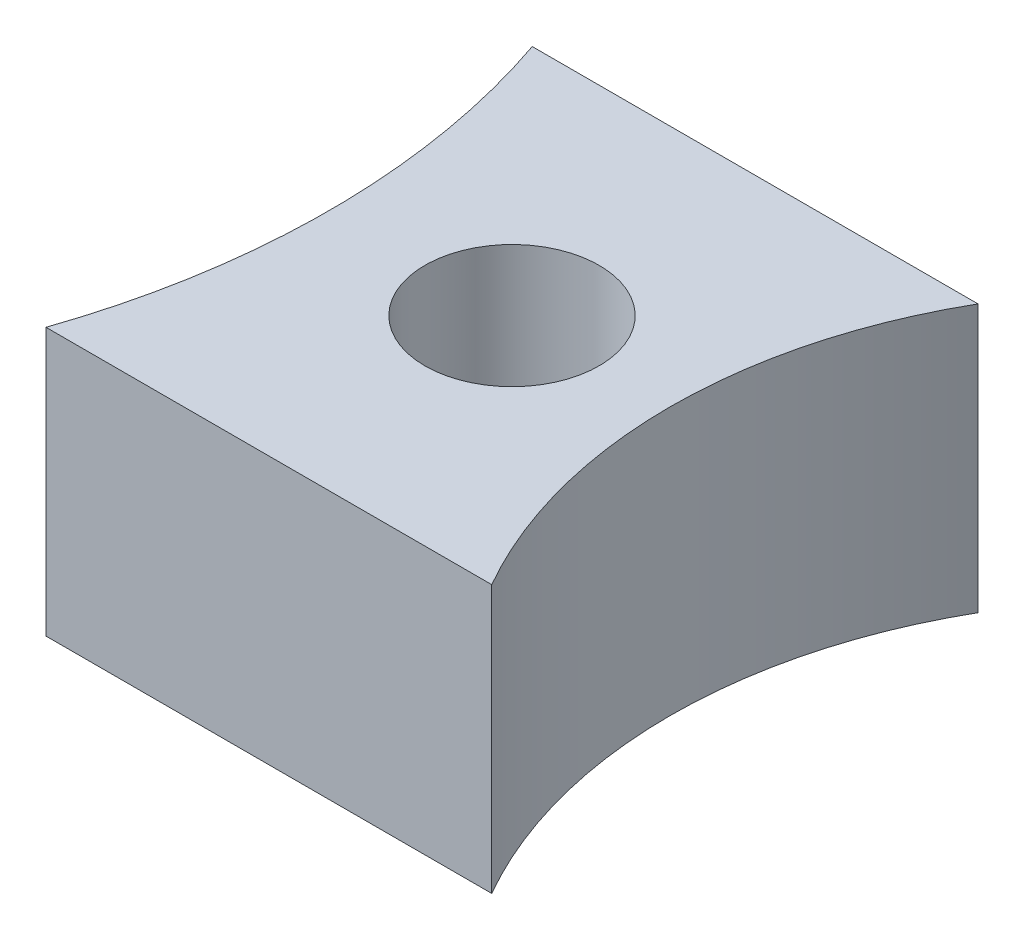
ISO-10303-21;
HEADER;
FILE_DESCRIPTION(('STEP AP214'),'2;1');
FILE_NAME('part.step','',(''),(''),'','','');
FILE_SCHEMA(('AUTOMOTIVE_DESIGN { 1 0 10303 214 1 1 1 1 }'));
ENDSEC;
DATA;
#1=APPLICATION_CONTEXT('core data for automotive mechanical design processes');
#2=APPLICATION_PROTOCOL_DEFINITION('international standard','automotive_design',2000,#1);
#3=PRODUCT_CONTEXT('',#1,'mechanical');
#4=PRODUCT('Part','Part','',(#3));
#5=PRODUCT_RELATED_PRODUCT_CATEGORY('part','',(#4));
#6=PRODUCT_DEFINITION_FORMATION('','',#4);
#7=PRODUCT_DEFINITION_CONTEXT('part definition',#1,'design');
#8=PRODUCT_DEFINITION('design','',#6,#7);
#9=PRODUCT_DEFINITION_SHAPE('','',#8);
#10=(LENGTH_UNIT() NAMED_UNIT(*) SI_UNIT(.MILLI.,.METRE.));
#11=(NAMED_UNIT(*) PLANE_ANGLE_UNIT() SI_UNIT($,.RADIAN.));
#12=(NAMED_UNIT(*) SI_UNIT($,.STERADIAN.) SOLID_ANGLE_UNIT());
#13=UNCERTAINTY_MEASURE_WITH_UNIT(LENGTH_MEASURE(1.E-05),#10,'distance_accuracy_value','');
#14=(GEOMETRIC_REPRESENTATION_CONTEXT(3) GLOBAL_UNCERTAINTY_ASSIGNED_CONTEXT((#13)) GLOBAL_UNIT_ASSIGNED_CONTEXT((#10,
#11,#12)) REPRESENTATION_CONTEXT('',''));
#15=CARTESIAN_POINT('',(0.,0.,0.));
#16=DIRECTION('',(0.,0.,1.));
#17=DIRECTION('',(1.,0.,0.));
#18=AXIS2_PLACEMENT_3D('',#15,#16,#17);
#19=CARTESIAN_POINT('',(-23.,6.6,0.));
#20=DIRECTION('',(0.,-1.,0.));
#21=DIRECTION('',(0.,0.,-1.));
#22=AXIS2_PLACEMENT_3D('',#19,#20,#21);
#23=CYLINDRICAL_SURFACE('',#22,18.5);
#24=CARTESIAN_POINT('',(-23.,0.,0.));
#25=DIRECTION('',(0.,1.,0.));
#26=DIRECTION('',(0.,0.,1.));
#27=AXIS2_PLACEMENT_3D('',#24,#25,#26);
#28=CIRCLE('',#27,18.5);
#29=CARTESIAN_POINT('',(-5.5,0.,6.));
#30=VERTEX_POINT('',#29);
#31=CARTESIAN_POINT('',(-5.5,0.,-6.));
#32=VERTEX_POINT('',#31);
#33=EDGE_CURVE('E115',#30,#32,#28,.T.);
#34=ORIENTED_EDGE('',*,*,#33,.F.);
#35=DIRECTION('',(0.,-1.,0.));
#36=VECTOR('',#35,1.);
#37=CARTESIAN_POINT('',(-5.5,6.6,6.));
#38=LINE('',#37,#36);
#39=CARTESIAN_POINT('',(-5.5,6.6,6.));
#40=VERTEX_POINT('',#39);
#41=EDGE_CURVE('E11',#40,#30,#38,.T.);
#42=ORIENTED_EDGE('',*,*,#41,.F.);
#43=CARTESIAN_POINT('',(-23.,6.6,0.));
#44=DIRECTION('',(0.,1.,0.));
#45=DIRECTION('',(0.,0.,1.));
#46=AXIS2_PLACEMENT_3D('',#43,#44,#45);
#47=CIRCLE('',#46,18.5);
#48=CARTESIAN_POINT('',(-5.5,6.6,-6.));
#49=VERTEX_POINT('',#48);
#50=EDGE_CURVE('E96',#40,#49,#47,.T.);
#51=ORIENTED_EDGE('',*,*,#50,.T.);
#52=DIRECTION('',(0.,-1.,0.));
#53=VECTOR('',#52,1.);
#54=CARTESIAN_POINT('',(-5.5,6.6,-6.));
#55=LINE('',#54,#53);
#56=EDGE_CURVE('E64',#49,#32,#55,.T.);
#57=ORIENTED_EDGE('',*,*,#56,.T.);
#58=EDGE_LOOP('',(#34,#42,#51,#57));
#59=FACE_BOUND('',#58,.T.);
#60=ADVANCED_FACE('F47',(#59),#23,.F.);
#61=CARTESIAN_POINT('',(0.,6.6,6.));
#62=DIRECTION('',(0.,0.,-1.));
#63=DIRECTION('',(-1.,0.,0.));
#64=AXIS2_PLACEMENT_3D('',#61,#62,#63);
#65=PLANE('',#64);
#66=DIRECTION('',(1.,0.,0.));
#67=VECTOR('',#66,1.);
#68=CARTESIAN_POINT('',(0.,0.,6.));
#69=LINE('',#68,#67);
#70=CARTESIAN_POINT('',(5.5,0.,6.));
#71=VERTEX_POINT('',#70);
#72=EDGE_CURVE('E103',#30,#71,#69,.T.);
#73=ORIENTED_EDGE('',*,*,#72,.T.);
#74=DIRECTION('',(0.,-1.,0.));
#75=VECTOR('',#74,1.);
#76=CARTESIAN_POINT('',(5.5,6.6,6.));
#77=LINE('',#76,#75);
#78=CARTESIAN_POINT('',(5.5,6.6,6.));
#79=VERTEX_POINT('',#78);
#80=EDGE_CURVE('E56',#79,#71,#77,.T.);
#81=ORIENTED_EDGE('',*,*,#80,.F.);
#82=DIRECTION('',(1.,0.,0.));
#83=VECTOR('',#82,1.);
#84=CARTESIAN_POINT('',(0.,6.6,6.));
#85=LINE('',#84,#83);
#86=EDGE_CURVE('E90',#40,#79,#85,.T.);
#87=ORIENTED_EDGE('',*,*,#86,.F.);
#88=ORIENTED_EDGE('',*,*,#41,.T.);
#89=EDGE_LOOP('',(#73,#81,#87,#88));
#90=FACE_BOUND('',#89,.T.);
#91=ADVANCED_FACE('F101',(#90),#65,.F.);
#92=CARTESIAN_POINT('',(15.95,6.6,0.));
#93=DIRECTION('',(0.,-1.,0.));
#94=DIRECTION('',(0.,0.,-1.));
#95=AXIS2_PLACEMENT_3D('',#92,#93,#94);
#96=CYLINDRICAL_SURFACE('',#95,12.05);
#97=CARTESIAN_POINT('',(15.95,0.,0.));
#98=DIRECTION('',(0.,1.,0.));
#99=DIRECTION('',(0.,0.,1.));
#100=AXIS2_PLACEMENT_3D('',#97,#98,#99);
#101=CIRCLE('',#100,12.05);
#102=CARTESIAN_POINT('',(5.5,0.,-6.));
#103=VERTEX_POINT('',#102);
#104=EDGE_CURVE('E121',#103,#71,#101,.T.);
#105=ORIENTED_EDGE('',*,*,#104,.F.);
#106=DIRECTION('',(0.,-1.,0.));
#107=VECTOR('',#106,1.);
#108=CARTESIAN_POINT('',(5.5,6.6,-6.));
#109=LINE('',#108,#107);
#110=CARTESIAN_POINT('',(5.5,6.6,-6.));
#111=VERTEX_POINT('',#110);
#112=EDGE_CURVE('E77',#111,#103,#109,.T.);
#113=ORIENTED_EDGE('',*,*,#112,.F.);
#114=CARTESIAN_POINT('',(15.95,6.6,0.));
#115=DIRECTION('',(0.,1.,0.));
#116=DIRECTION('',(0.,0.,1.));
#117=AXIS2_PLACEMENT_3D('',#114,#115,#116);
#118=CIRCLE('',#117,12.05);
#119=EDGE_CURVE('E95',#111,#79,#118,.T.);
#120=ORIENTED_EDGE('',*,*,#119,.T.);
#121=ORIENTED_EDGE('',*,*,#80,.T.);
#122=EDGE_LOOP('',(#105,#113,#120,#121));
#123=FACE_BOUND('',#122,.T.);
#124=ADVANCED_FACE('F107',(#123),#96,.F.);
#125=CARTESIAN_POINT('',(0.,6.6,-6.));
#126=DIRECTION('',(0.,0.,-1.));
#127=DIRECTION('',(-1.,0.,0.));
#128=AXIS2_PLACEMENT_3D('',#125,#126,#127);
#129=PLANE('',#128);
#130=DIRECTION('',(1.,0.,0.));
#131=VECTOR('',#130,1.);
#132=CARTESIAN_POINT('',(0.,0.,-6.));
#133=LINE('',#132,#131);
#134=EDGE_CURVE('E124',#32,#103,#133,.T.);
#135=ORIENTED_EDGE('',*,*,#134,.F.);
#136=ORIENTED_EDGE('',*,*,#56,.F.);
#137=DIRECTION('',(1.,0.,0.));
#138=VECTOR('',#137,1.);
#139=CARTESIAN_POINT('',(0.,6.6,-6.));
#140=LINE('',#139,#138);
#141=EDGE_CURVE('E109',#49,#111,#140,.T.);
#142=ORIENTED_EDGE('',*,*,#141,.T.);
#143=ORIENTED_EDGE('',*,*,#112,.T.);
#144=EDGE_LOOP('',(#135,#136,#142,#143));
#145=FACE_BOUND('',#144,.T.);
#146=ADVANCED_FACE('F146',(#145),#129,.T.);
#147=CARTESIAN_POINT('',(0.,6.6,0.));
#148=DIRECTION('',(0.,1.,0.));
#149=DIRECTION('',(0.,0.,1.));
#150=AXIS2_PLACEMENT_3D('',#147,#148,#149);
#151=PLANE('',#150);
#152=CARTESIAN_POINT('',(0.,6.6,0.));
#153=DIRECTION('',(0.,1.,0.));
#154=DIRECTION('',(0.,0.,1.));
#155=AXIS2_PLACEMENT_3D('',#152,#153,#154);
#156=CIRCLE('',#155,2.14999999999999);
#157=CARTESIAN_POINT('',(0.,6.6,2.14999999999999));
#158=VERTEX_POINT('',#157);
#159=EDGE_CURVE('E137',#158,#158,#156,.T.);
#160=ORIENTED_EDGE('',*,*,#159,.F.);
#161=EDGE_LOOP('',(#160));
#162=FACE_BOUND('',#161,.T.);
#163=ORIENTED_EDGE('',*,*,#50,.F.);
#164=ORIENTED_EDGE('',*,*,#86,.T.);
#165=ORIENTED_EDGE('',*,*,#119,.F.);
#166=ORIENTED_EDGE('',*,*,#141,.F.);
#167=EDGE_LOOP('',(#163,#164,#165,#166));
#168=FACE_BOUND('',#167,.T.);
#169=ADVANCED_FACE('F92',(#162,#168),#151,.T.);
#170=CARTESIAN_POINT('',(0.,0.,0.));
#171=DIRECTION('',(0.,1.,0.));
#172=DIRECTION('',(0.,0.,1.));
#173=AXIS2_PLACEMENT_3D('',#170,#171,#172);
#174=PLANE('',#173);
#175=CARTESIAN_POINT('',(0.,0.,0.));
#176=DIRECTION('',(0.,1.,0.));
#177=DIRECTION('',(0.,0.,1.));
#178=AXIS2_PLACEMENT_3D('',#175,#176,#177);
#179=CIRCLE('',#178,2.14999999999999);
#180=CARTESIAN_POINT('',(0.,0.,2.14999999999999));
#181=VERTEX_POINT('',#180);
#182=EDGE_CURVE('E118',#181,#181,#179,.T.);
#183=ORIENTED_EDGE('',*,*,#182,.T.);
#184=EDGE_LOOP('',(#183));
#185=FACE_BOUND('',#184,.T.);
#186=ORIENTED_EDGE('',*,*,#33,.T.);
#187=ORIENTED_EDGE('',*,*,#134,.T.);
#188=ORIENTED_EDGE('',*,*,#104,.T.);
#189=ORIENTED_EDGE('',*,*,#72,.F.);
#190=EDGE_LOOP('',(#186,#187,#188,#189));
#191=FACE_BOUND('',#190,.T.);
#192=ADVANCED_FACE('F145',(#185,#191),#174,.F.);
#193=CARTESIAN_POINT('',(0.,6.6,0.));
#194=DIRECTION('',(0.,1.,0.));
#195=DIRECTION('',(0.,0.,1.));
#196=AXIS2_PLACEMENT_3D('',#193,#194,#195);
#197=CYLINDRICAL_SURFACE('',#196,2.14999999999999);
#198=ORIENTED_EDGE('',*,*,#182,.F.);
#199=EDGE_LOOP('',(#198));
#200=FACE_BOUND('',#199,.T.);
#201=ORIENTED_EDGE('',*,*,#159,.T.);
#202=EDGE_LOOP('',(#201));
#203=FACE_BOUND('',#202,.T.);
#204=ADVANCED_FACE('F142',(#200,#203),#197,.F.);
#205=CLOSED_SHELL('',(#60,#91,#124,#146,#169,#192,#204));
#206=MANIFOLD_SOLID_BREP('B2',#205);
#207=ADVANCED_BREP_SHAPE_REPRESENTATION('',(#18,#206),#14);
#208=SHAPE_DEFINITION_REPRESENTATION(#9,#207);
ENDSEC;
END-ISO-10303-21;
